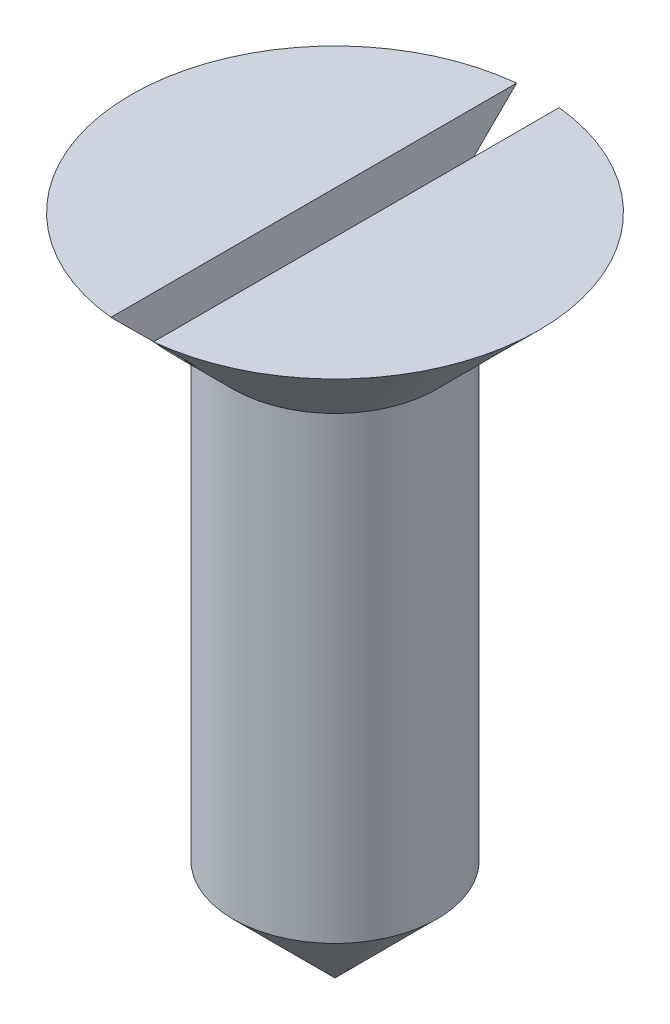
ISO-10303-21;
HEADER;
FILE_DESCRIPTION(('STEP AP214'),'2;1');
FILE_NAME('part.step','',(''),(''),'','','');
FILE_SCHEMA(('AUTOMOTIVE_DESIGN { 1 0 10303 214 1 1 1 1 }'));
ENDSEC;
DATA;
#1=APPLICATION_CONTEXT('core data for automotive mechanical design processes');
#2=APPLICATION_PROTOCOL_DEFINITION('international standard','automotive_design',2000,#1);
#3=PRODUCT_CONTEXT('',#1,'mechanical');
#4=PRODUCT('Part','Part','',(#3));
#5=PRODUCT_RELATED_PRODUCT_CATEGORY('part','',(#4));
#6=PRODUCT_DEFINITION_FORMATION('','',#4);
#7=PRODUCT_DEFINITION_CONTEXT('part definition',#1,'design');
#8=PRODUCT_DEFINITION('design','',#6,#7);
#9=PRODUCT_DEFINITION_SHAPE('','',#8);
#10=(LENGTH_UNIT() NAMED_UNIT(*) SI_UNIT(.MILLI.,.METRE.));
#11=(NAMED_UNIT(*) PLANE_ANGLE_UNIT() SI_UNIT($,.RADIAN.));
#12=(NAMED_UNIT(*) SI_UNIT($,.STERADIAN.) SOLID_ANGLE_UNIT());
#13=UNCERTAINTY_MEASURE_WITH_UNIT(LENGTH_MEASURE(1.E-05),#10,'distance_accuracy_value','');
#14=(GEOMETRIC_REPRESENTATION_CONTEXT(3) GLOBAL_UNCERTAINTY_ASSIGNED_CONTEXT((#13)) GLOBAL_UNIT_ASSIGNED_CONTEXT((#10,
#11,#12)) REPRESENTATION_CONTEXT('',''));
#15=CARTESIAN_POINT('',(0.,0.,0.));
#16=DIRECTION('',(0.,0.,1.));
#17=DIRECTION('',(1.,0.,0.));
#18=AXIS2_PLACEMENT_3D('',#15,#16,#17);
#19=CARTESIAN_POINT('',(0.,39.,-12.));
#20=DIRECTION('',(0.,-1.,0.));
#21=DIRECTION('',(0.,0.,-1.));
#22=AXIS2_PLACEMENT_3D('',#19,#20,#21);
#23=PLANE('',#22);
#24=CARTESIAN_POINT('',(0.,39.,0.));
#25=DIRECTION('',(0.,1.,0.));
#26=DIRECTION('',(0.,0.,1.));
#27=AXIS2_PLACEMENT_3D('',#24,#25,#26);
#28=CIRCLE('',#27,12.);
#29=CARTESIAN_POINT('',(-1.25,39.,-11.93471826228));
#30=VERTEX_POINT('',#29);
#31=CARTESIAN_POINT('',(-1.25,39.,11.93471826228));
#32=VERTEX_POINT('',#31);
#33=EDGE_CURVE('E127',#30,#32,#28,.T.);
#34=ORIENTED_EDGE('',*,*,#33,.T.);
#35=DIRECTION('',(0.,0.,1.));
#36=VECTOR('',#35,1.);
#37=CARTESIAN_POINT('',(-1.25,39.,-12.));
#38=LINE('',#37,#36);
#39=EDGE_CURVE('E140',#30,#32,#38,.T.);
#40=ORIENTED_EDGE('',*,*,#39,.F.);
#41=EDGE_LOOP('',(#34,#40));
#42=FACE_BOUND('',#41,.T.);
#43=ADVANCED_FACE('F46',(#42),#23,.F.);
#44=CARTESIAN_POINT('',(1.25,39.,11.93471826228));
#45=VERTEX_POINT('',#44);
#46=CARTESIAN_POINT('',(1.25,39.,-11.93471826228));
#47=VERTEX_POINT('',#46);
#48=EDGE_CURVE('E115',#45,#47,#28,.T.);
#49=ORIENTED_EDGE('',*,*,#48,.T.);
#50=DIRECTION('',(0.,0.,1.));
#51=VECTOR('',#50,1.);
#52=CARTESIAN_POINT('',(1.25,39.,-12.));
#53=LINE('',#52,#51);
#54=EDGE_CURVE('E109',#47,#45,#53,.T.);
#55=ORIENTED_EDGE('',*,*,#54,.T.);
#56=EDGE_LOOP('',(#49,#55));
#57=FACE_BOUND('',#56,.T.);
#58=ADVANCED_FACE('F48',(#57),#23,.F.);
#59=CARTESIAN_POINT('',(0.,33.,0.));
#60=DIRECTION('',(0.,1.,0.));
#61=DIRECTION('',(0.,0.,1.));
#62=AXIS2_PLACEMENT_3D('',#59,#60,#61);
#63=CONICAL_SURFACE('',#62,6.,0.785398163397449);
#64=CARTESIAN_POINT('',(0.,36.5,0.));
#65=DIRECTION('',(0.,-1.,0.));
#66=DIRECTION('',(0.,0.,-1.));
#67=AXIS2_PLACEMENT_3D('',#64,#65,#66);
#68=CIRCLE('',#67,9.49999999999999);
#69=CARTESIAN_POINT('',(1.25,36.5,9.41740410091868));
#70=VERTEX_POINT('',#69);
#71=CARTESIAN_POINT('',(-1.25,36.5,9.41740410091868));
#72=VERTEX_POINT('',#71);
#73=EDGE_CURVE('E93',#70,#72,#68,.T.);
#74=ORIENTED_EDGE('',*,*,#73,.T.);
#75=CARTESIAN_POINT('',(-1.25,39.0007,-11.9354220909861));
#76=CARTESIAN_POINT('',(-1.25,38.6525245051096,-11.5853335580358));
#77=CARTESIAN_POINT('',(-1.25,38.3044242351181,-11.2351701150766));
#78=CARTESIAN_POINT('',(-1.25,37.6083997013895,-10.5345761604297));
#79=CARTESIAN_POINT('',(-1.25,37.260475467087,-10.1841456195013));
#80=CARTESIAN_POINT('',(-1.25,36.5638094649016,-9.48187261037133));
#81=CARTESIAN_POINT('',(-1.25,36.2150686376639,-9.13002920888125));
#82=CARTESIAN_POINT('',(-1.25,35.5180469301886,-8.42597796118086));
#83=CARTESIAN_POINT('',(-1.25,35.1697659958149,-8.07377016858714));
#84=CARTESIAN_POINT('',(-1.25,34.5835484113192,-7.47991876315877));
#85=CARTESIAN_POINT('',(-1.25,34.3454501475208,-7.23843471058512));
#86=CARTESIAN_POINT('',(-1.25,33.8696338699101,-6.75508570505137));
#87=CARTESIAN_POINT('',(-1.25,33.6319158612806,-6.51322074698736));
#88=CARTESIAN_POINT('',(-1.25,33.1569017391557,-6.02886263739927));
#89=CARTESIAN_POINT('',(-1.25,32.9196058643398,-5.78636925172159));
#90=CARTESIAN_POINT('',(-1.25,32.4457841652544,-5.30065426789219));
#91=CARTESIAN_POINT('',(-1.25,32.2092583028591,-5.05743270697563));
#92=CARTESIAN_POINT('',(-1.25,31.7380212186018,-4.57056656101441));
#93=CARTESIAN_POINT('',(-1.25,31.5033067580083,-4.32692511205818));
#94=CARTESIAN_POINT('',(-1.25,31.0356433755412,-3.83785715356192));
#95=CARTESIAN_POINT('',(-1.25,30.802694798138,-3.5924303131586));
#96=CARTESIAN_POINT('',(-1.25,30.4558116431846,-3.2221040902199));
#97=CARTESIAN_POINT('',(-1.25,30.3406552607435,-3.09835036206003));
#98=CARTESIAN_POINT('',(-1.25,30.1114963369343,-2.84978045689656));
#99=CARTESIAN_POINT('',(-1.25,29.9974937738428,-2.72496429997744));
#100=CARTESIAN_POINT('',(-1.25,29.7711960829232,-2.4738608234374));
#101=CARTESIAN_POINT('',(-1.25,29.6589004417358,-2.34757396715293));
#102=CARTESIAN_POINT('',(-1.25,29.436859547192,-2.09278298539628));
#103=CARTESIAN_POINT('',(-1.25,29.3271139756621,-1.96427914006313));
#104=CARTESIAN_POINT('',(-1.25,29.1774082722368,-1.78309022945998));
#105=CARTESIAN_POINT('',(-1.25,29.1356513559321,-1.73189116307278));
#106=CARTESIAN_POINT('',(-1.25,29.0529570382234,-1.62882904129065));
#107=CARTESIAN_POINT('',(-1.25,29.0120196825618,-1.57696594909774));
#108=CARTESIAN_POINT('',(-1.25,28.9310932318212,-1.4723191243794));
#109=CARTESIAN_POINT('',(-1.25,28.8911064367148,-1.41953360786599));
#110=CARTESIAN_POINT('',(-1.25,28.8124816309744,-1.31296791579874));
#111=CARTESIAN_POINT('',(-1.25,28.7738435381623,-1.25918780115358));
#112=CARTESIAN_POINT('',(-1.25,28.6991593148868,-1.15156923623819));
#113=CARTESIAN_POINT('',(-1.25,28.6630751540591,-1.09775732173723));
#114=CARTESIAN_POINT('',(-1.25,28.5931825883663,-0.98867851148293));
#115=CARTESIAN_POINT('',(-1.25,28.5593736969807,-0.933411930319338));
#116=CARTESIAN_POINT('',(-1.25,28.4949486286121,-0.821263218535581));
#117=CARTESIAN_POINT('',(-1.25,28.4643227077729,-0.764386739962954));
#118=CARTESIAN_POINT('',(-1.25,28.4073327663661,-0.648555286148307));
#119=CARTESIAN_POINT('',(-1.25,28.3809646157921,-0.589602393471735));
#120=CARTESIAN_POINT('',(-1.25,28.3428892594081,-0.49197789625088));
#121=CARTESIAN_POINT('',(-1.25,28.3293952980765,-0.454005435763385));
#122=CARTESIAN_POINT('',(-1.25,28.3051566046379,-0.377176692319916));
#123=CARTESIAN_POINT('',(-1.25,28.2944121158857,-0.33832033146147));
#124=CARTESIAN_POINT('',(-1.25,28.2761990986869,-0.260045837222044));
#125=CARTESIAN_POINT('',(-1.25,28.2687141052042,-0.220631590767506));
#126=CARTESIAN_POINT('',(-1.25,28.2573473696156,-0.141289084674286));
#127=CARTESIAN_POINT('',(-1.25,28.2534646603366,-0.101360965925223));
#128=CARTESIAN_POINT('',(-1.25,28.2495275508759,-0.0209912945952001));
#129=CARTESIAN_POINT('',(-1.25,28.2495039629859,0.0194518120669204));
#130=CARTESIAN_POINT('',(-1.25,28.2533549428478,0.100142095433587));
#131=CARTESIAN_POINT('',(-1.25,28.2572295713321,0.140389269075773));
#132=CARTESIAN_POINT('',(-1.25,28.2744220170101,0.260627237955868));
#133=CARTESIAN_POINT('',(-1.25,28.2933192086121,0.339848721368009));
#134=CARTESIAN_POINT('',(-1.25,28.3369996632204,0.477952449732306));
#135=CARTESIAN_POINT('',(-1.25,28.3596588536414,0.53756019885441));
#136=CARTESIAN_POINT('',(-1.25,28.4100540592309,0.654626703701392));
#137=CARTESIAN_POINT('',(-1.25,28.4377942910572,0.712083626442973));
#138=CARTESIAN_POINT('',(-1.25,28.4970797779295,0.825279661233912));
#139=CARTESIAN_POINT('',(-1.25,28.5286409647805,0.881010272725492));
#140=CARTESIAN_POINT('',(-1.25,28.5944529567601,0.990811205534264));
#141=CARTESIAN_POINT('',(-1.25,28.6287025732185,1.04488224607261));
#142=CARTESIAN_POINT('',(-1.25,28.706111257564,1.16216243800432));
#143=CARTESIAN_POINT('',(-1.25,28.7497008806269,1.22508556204342));
#144=CARTESIAN_POINT('',(-1.25,28.8389347525384,1.34946405056997));
#145=CARTESIAN_POINT('',(-1.25,28.8845793989563,1.41091912749546));
#146=CARTESIAN_POINT('',(-1.25,28.9774126218919,1.53271508372005));
#147=CARTESIAN_POINT('',(-1.25,29.0246022557831,1.59305515378818));
#148=CARTESIAN_POINT('',(-1.25,29.1201309129274,1.71282037918469));
#149=CARTESIAN_POINT('',(-1.25,29.1684699978561,1.772245485136));
#150=CARTESIAN_POINT('',(-1.25,29.315032031704,1.94970889129089));
#151=CARTESIAN_POINT('',(-1.25,29.4145794737038,2.06665177320021));
#152=CARTESIAN_POINT('',(-1.25,29.6158372128505,2.29856208993548));
#153=CARTESIAN_POINT('',(-1.25,29.717546619238,2.41353030435738));
#154=CARTESIAN_POINT('',(-1.25,29.9228336203681,2.64254418741588));
#155=CARTESIAN_POINT('',(-1.25,30.0264166899379,2.75658493991201));
#156=CARTESIAN_POINT('',(-1.25,30.2346495690056,2.98370692535466));
#157=CARTESIAN_POINT('',(-1.25,30.3392994843653,3.09678806099869));
#158=CARTESIAN_POINT('',(-1.25,30.5492131099833,3.32205963713631));
#159=CARTESIAN_POINT('',(-1.25,30.6544756550516,3.43425116459413));
#160=CARTESIAN_POINT('',(-1.25,30.8655774781278,3.65808266330164));
#161=CARTESIAN_POINT('',(-1.25,30.9714167367748,3.76972265283019));
#162=CARTESIAN_POINT('',(-1.25,31.2416062861267,4.05358272236062));
#163=CARTESIAN_POINT('',(-1.25,31.4062669307094,4.2255072755563));
#164=CARTESIAN_POINT('',(-1.25,31.7363301244144,4.56864310479997));
#165=CARTESIAN_POINT('',(-1.25,31.9017326766139,4.73985437788389));
#166=CARTESIAN_POINT('',(-1.25,32.398742505554,5.25272566021114));
#167=CARTESIAN_POINT('',(-1.25,32.7311444241238,5.59361526468402));
#168=CARTESIAN_POINT('',(-1.25,33.3973800552396,6.27445559409243));
#169=CARTESIAN_POINT('',(-1.25,33.7312146047303,6.61440549833784));
#170=CARTESIAN_POINT('',(-1.25,34.3996449682564,7.29354878227994));
#171=CARTESIAN_POINT('',(-1.25,34.7342407741569,7.63274216998474));
#172=CARTESIAN_POINT('',(-1.25,35.3961878876222,8.30277573987706));
#173=CARTESIAN_POINT('',(-1.25,35.7235275230669,8.6336274596084));
#174=CARTESIAN_POINT('',(-1.25,36.378553192289,9.2949900616984));
#175=CARTESIAN_POINT('',(-1.25,36.7062392272741,9.6255009428607));
#176=CARTESIAN_POINT('',(-1.25,37.3616137769747,10.2860214547972));
#177=CARTESIAN_POINT('',(-1.25,37.6893021001907,10.6160312756177));
#178=CARTESIAN_POINT('',(-1.25,38.3448710011219,11.2758572737765));
#179=CARTESIAN_POINT('',(-1.25,38.6727515780574,11.6056734518895));
#180=CARTESIAN_POINT('',(-1.25,39.0007,11.9354220909861));
#181=B_SPLINE_CURVE_WITH_KNOTS('',3,(#75,#76,#77,#78,#79,#80,#81,#82,#83,#84,#85,#86,#87,#88,
#89,#90,#91,#92,#93,#94,#95,#96,#97,#98,#99,#100,#101,#102,#103,#104,#105,#106,#107,#108,#109,
#110,#111,#112,#113,#114,#115,#116,#117,#118,#119,#120,#121,#122,#123,#124,#125,#126,#127,#128,
#129,#130,#131,#132,#133,#134,#135,#136,#137,#138,#139,#140,#141,#142,#143,#144,#145,#146,#147,
#148,#149,#150,#151,#152,#153,#154,#155,#156,#157,#158,#159,#160,#161,#162,#163,#164,#165,#166,
#167,#168,#169,#170,#171,#172,#173,#174,#175,#176,#177,#178,#179,#180),.UNSPECIFIED.,.F.,.F.,(4,
2,2,2,2,2,2,2,2,2,2,2,2,2,2,2,2,2,2,2,2,2,2,2,2,2,2,2,2,2,2,2,2,2,2,2,2,2,2,2,2,2,2,2,2,2,2,2,2,
2,2,2,4),(0.,1.48124734020911,2.96269095913178,4.44886889217836,5.93485266870816,
6.95222545257565,7.96961198666254,8.98745744626457,10.0052517183322,11.020170729965,
12.0352828744004,12.5424112024878,13.0495299648661,13.5564930661247,14.0633925699557,
14.2615902679118,14.459798997241,14.6584465356212,14.8570819489484,15.0514115121183,
15.2456993889189,15.4393738063946,15.6328592176713,15.7536715461804,15.8744945640453,
15.9946999686907,16.114873090185,16.2360056606475,16.3571401183279,16.6001939998898,
16.791251093002,16.9824674650419,17.1745105248865,17.3664691474144,17.596050131405,
17.8256757231008,18.055461895759,18.2852604259298,18.7459340615126,19.2064214374358,
19.6685940809082,20.1308130404963,20.5923341749688,21.0538399098706,21.7680076235377,
22.4821783019973,23.9105523309204,25.339922627226,26.769277720437,28.165532010017,
29.5617911839766,30.9569882432444,32.3521796828529),.UNSPECIFIED.);
#182=EDGE_CURVE('E12',#72,#32,#181,.T.);
#183=ORIENTED_EDGE('',*,*,#182,.T.);
#184=ORIENTED_EDGE('',*,*,#33,.F.);
#185=CARTESIAN_POINT('',(-1.25,36.5,-9.41740410091868));
#186=VERTEX_POINT('',#185);
#187=EDGE_CURVE('E50',#30,#186,#181,.T.);
#188=ORIENTED_EDGE('',*,*,#187,.T.);
#189=CARTESIAN_POINT('',(1.25,36.5,-9.41740410091868));
#190=VERTEX_POINT('',#189);
#191=EDGE_CURVE('E101',#186,#190,#68,.T.);
#192=ORIENTED_EDGE('',*,*,#191,.T.);
#193=CARTESIAN_POINT('',(1.25,39.0007,11.9354220909861));
#194=CARTESIAN_POINT('',(1.25,38.6525245051096,11.5853335580358));
#195=CARTESIAN_POINT('',(1.25,38.3044242351181,11.2351701150766));
#196=CARTESIAN_POINT('',(1.25,37.6083997013895,10.5345761604297));
#197=CARTESIAN_POINT('',(1.25,37.260475467087,10.1841456195013));
#198=CARTESIAN_POINT('',(1.25,36.5638094649016,9.48187261037132));
#199=CARTESIAN_POINT('',(1.25,36.2150686376639,9.13002920888124));
#200=CARTESIAN_POINT('',(1.25,35.5180469301886,8.42597796118085));
#201=CARTESIAN_POINT('',(1.25,35.1697659958149,8.07377016858713));
#202=CARTESIAN_POINT('',(1.25,34.5835484113192,7.47991876315877));
#203=CARTESIAN_POINT('',(1.25,34.3454501475208,7.23843471058511));
#204=CARTESIAN_POINT('',(1.25,33.8696338699101,6.75508570505136));
#205=CARTESIAN_POINT('',(1.25,33.6319158612806,6.51322074698735));
#206=CARTESIAN_POINT('',(1.25,33.1569017391557,6.02886263739926));
#207=CARTESIAN_POINT('',(1.25,32.9196058643398,5.78636925172158));
#208=CARTESIAN_POINT('',(1.25,32.4457841652544,5.30065426789218));
#209=CARTESIAN_POINT('',(1.25,32.2092583028591,5.05743270697562));
#210=CARTESIAN_POINT('',(1.25,31.7380212186018,4.5705665610144));
#211=CARTESIAN_POINT('',(1.25,31.5033067580083,4.32692511205817));
#212=CARTESIAN_POINT('',(1.25,31.0356433755412,3.83785715356191));
#213=CARTESIAN_POINT('',(1.25,30.802694798138,3.59243031315859));
#214=CARTESIAN_POINT('',(1.25,30.4558116431846,3.2221040902199));
#215=CARTESIAN_POINT('',(1.25,30.3406552607435,3.09835036206002));
#216=CARTESIAN_POINT('',(1.25,30.1114963369343,2.84978045689655));
#217=CARTESIAN_POINT('',(1.25,29.9974937738428,2.72496429997744));
#218=CARTESIAN_POINT('',(1.25,29.7711960829232,2.47386082343739));
#219=CARTESIAN_POINT('',(1.25,29.6589004417358,2.34757396715292));
#220=CARTESIAN_POINT('',(1.25,29.436859547192,2.09278298539628));
#221=CARTESIAN_POINT('',(1.25,29.3271139756621,1.96427914006313));
#222=CARTESIAN_POINT('',(1.25,29.1774082722368,1.78309022945998));
#223=CARTESIAN_POINT('',(1.25,29.1356513559321,1.73189116307278));
#224=CARTESIAN_POINT('',(1.25,29.0529570382234,1.62882904129065));
#225=CARTESIAN_POINT('',(1.25,29.0120196825618,1.57696594909774));
#226=CARTESIAN_POINT('',(1.25,28.9310932318212,1.4723191243794));
#227=CARTESIAN_POINT('',(1.25,28.8911064367148,1.41953360786599));
#228=CARTESIAN_POINT('',(1.25,28.8124816309744,1.31296791579874));
#229=CARTESIAN_POINT('',(1.25,28.7738435381623,1.25918780115358));
#230=CARTESIAN_POINT('',(1.25,28.6991593148867,1.15156923623819));
#231=CARTESIAN_POINT('',(1.25,28.6630751540591,1.09775732173723));
#232=CARTESIAN_POINT('',(1.25,28.5931825883663,0.988678511482929));
#233=CARTESIAN_POINT('',(1.25,28.5593736969807,0.933411930319337));
#234=CARTESIAN_POINT('',(1.25,28.4949486286121,0.821263218535581));
#235=CARTESIAN_POINT('',(1.25,28.4643227077729,0.764386739962954));
#236=CARTESIAN_POINT('',(1.25,28.4073327663661,0.648555286148308));
#237=CARTESIAN_POINT('',(1.25,28.3809646157921,0.589602393471735));
#238=CARTESIAN_POINT('',(1.25,28.3428892594081,0.49197789625088));
#239=CARTESIAN_POINT('',(1.25,28.3293952980765,0.454005435763384));
#240=CARTESIAN_POINT('',(1.25,28.3051566046379,0.377176692319916));
#241=CARTESIAN_POINT('',(1.25,28.2944121158857,0.33832033146147));
#242=CARTESIAN_POINT('',(1.25,28.2761990986869,0.260045837222045));
#243=CARTESIAN_POINT('',(1.25,28.2687141052042,0.220631590767506));
#244=CARTESIAN_POINT('',(1.25,28.2573473696156,0.141289084674287));
#245=CARTESIAN_POINT('',(1.25,28.2534646603366,0.101360965925224));
#246=CARTESIAN_POINT('',(1.25,28.2495275508759,0.0209912945952015));
#247=CARTESIAN_POINT('',(1.25,28.2495039629859,-0.0194518120669193));
#248=CARTESIAN_POINT('',(1.25,28.2533549428478,-0.100142095433587));
#249=CARTESIAN_POINT('',(1.25,28.2572295713321,-0.140389269075773));
#250=CARTESIAN_POINT('',(1.25,28.2744220170101,-0.260627237955867));
#251=CARTESIAN_POINT('',(1.25,28.2933192086121,-0.339848721368008));
#252=CARTESIAN_POINT('',(1.25,28.3369996632204,-0.477952449732306));
#253=CARTESIAN_POINT('',(1.25,28.3596588536414,-0.537560198854412));
#254=CARTESIAN_POINT('',(1.25,28.4100540592309,-0.654626703701393));
#255=CARTESIAN_POINT('',(1.25,28.4377942910572,-0.712083626442973));
#256=CARTESIAN_POINT('',(1.25,28.4970797779295,-0.825279661233913));
#257=CARTESIAN_POINT('',(1.25,28.5286409647805,-0.881010272725494));
#258=CARTESIAN_POINT('',(1.25,28.5944529567601,-0.990811205534266));
#259=CARTESIAN_POINT('',(1.25,28.6287025732185,-1.04488224607261));
#260=CARTESIAN_POINT('',(1.25,28.706111257564,-1.16216243800432));
#261=CARTESIAN_POINT('',(1.25,28.7497008806269,-1.22508556204342));
#262=CARTESIAN_POINT('',(1.25,28.8389347525384,-1.34946405056997));
#263=CARTESIAN_POINT('',(1.25,28.8845793989563,-1.41091912749545));
#264=CARTESIAN_POINT('',(1.25,28.9774126218919,-1.53271508372004));
#265=CARTESIAN_POINT('',(1.25,29.0246022557831,-1.59305515378817));
#266=CARTESIAN_POINT('',(1.25,29.1201309129274,-1.71282037918469));
#267=CARTESIAN_POINT('',(1.25,29.1684699978561,-1.77224548513599));
#268=CARTESIAN_POINT('',(1.25,29.315032031704,-1.94970889129088));
#269=CARTESIAN_POINT('',(1.25,29.4145794737038,-2.0666517732002));
#270=CARTESIAN_POINT('',(1.25,29.6158372128505,-2.29856208993547));
#271=CARTESIAN_POINT('',(1.25,29.717546619238,-2.41353030435737));
#272=CARTESIAN_POINT('',(1.25,29.9228336203681,-2.64254418741587));
#273=CARTESIAN_POINT('',(1.25,30.0264166899379,-2.756584939912));
#274=CARTESIAN_POINT('',(1.25,30.2346495690056,-2.98370692535465));
#275=CARTESIAN_POINT('',(1.25,30.3392994843652,-3.09678806099868));
#276=CARTESIAN_POINT('',(1.25,30.5492131099833,-3.3220596371363));
#277=CARTESIAN_POINT('',(1.25,30.6544756550516,-3.43425116459412));
#278=CARTESIAN_POINT('',(1.25,30.8655774781278,-3.65808266330163));
#279=CARTESIAN_POINT('',(1.25,30.9714167367748,-3.76972265283018));
#280=CARTESIAN_POINT('',(1.25,31.2416062861267,-4.05358272236061));
#281=CARTESIAN_POINT('',(1.25,31.4062669307094,-4.2255072755563));
#282=CARTESIAN_POINT('',(1.25,31.7363301244144,-4.56864310479997));
#283=CARTESIAN_POINT('',(1.25,31.9017326766139,-4.73985437788388));
#284=CARTESIAN_POINT('',(1.25,32.398742505554,-5.25272566021113));
#285=CARTESIAN_POINT('',(1.25,32.7311444241238,-5.59361526468401));
#286=CARTESIAN_POINT('',(1.25,33.3973800552395,-6.27445559409242));
#287=CARTESIAN_POINT('',(1.25,33.7312146047303,-6.61440549833783));
#288=CARTESIAN_POINT('',(1.25,34.3996449682564,-7.29354878227994));
#289=CARTESIAN_POINT('',(1.25,34.7342407741569,-7.63274216998474));
#290=CARTESIAN_POINT('',(1.25,35.3961878876222,-8.30277573987706));
#291=CARTESIAN_POINT('',(1.25,35.7235275230669,-8.6336274596084));
#292=CARTESIAN_POINT('',(1.25,36.378553192289,-9.2949900616984));
#293=CARTESIAN_POINT('',(1.25,36.7062392272741,-9.6255009428607));
#294=CARTESIAN_POINT('',(1.25,37.3616137769747,-10.2860214547972));
#295=CARTESIAN_POINT('',(1.25,37.6893021001907,-10.6160312756177));
#296=CARTESIAN_POINT('',(1.25,38.3448710011219,-11.2758572737765));
#297=CARTESIAN_POINT('',(1.25,38.6727515780574,-11.6056734518895));
#298=CARTESIAN_POINT('',(1.25,39.0007,-11.9354220909861));
#299=B_SPLINE_CURVE_WITH_KNOTS('',3,(#193,#194,#195,#196,#197,#198,#199,#200,#201,#202,#203,
#204,#205,#206,#207,#208,#209,#210,#211,#212,#213,#214,#215,#216,#217,#218,#219,#220,#221,#222,
#223,#224,#225,#226,#227,#228,#229,#230,#231,#232,#233,#234,#235,#236,#237,#238,#239,#240,#241,
#242,#243,#244,#245,#246,#247,#248,#249,#250,#251,#252,#253,#254,#255,#256,#257,#258,#259,#260,
#261,#262,#263,#264,#265,#266,#267,#268,#269,#270,#271,#272,#273,#274,#275,#276,#277,#278,#279,
#280,#281,#282,#283,#284,#285,#286,#287,#288,#289,#290,#291,#292,#293,#294,#295,#296,#297,#298),
.UNSPECIFIED.,.F.,.F.,(4,2,2,2,2,2,2,2,2,2,2,2,2,2,2,2,2,2,2,2,2,2,2,2,2,2,2,2,2,2,2,2,2,2,2,2,
2,2,2,2,2,2,2,2,2,2,2,2,2,2,2,2,4),(0.,1.48124734020911,2.9626909591318,4.44886889217837,
5.93485266870818,6.95222545257567,7.96961198666255,8.98745744626458,10.0052517183322,
11.020170729965,12.0352828744004,12.5424112024878,13.0495299648662,13.5564930661247,
14.0633925699557,14.2615902679118,14.459798997241,14.6584465356212,14.8570819489484,
15.0514115121183,15.2456993889189,15.4393738063946,15.6328592176713,15.7536715461804,
15.8744945640453,15.9946999686907,16.114873090185,16.2360056606475,16.3571401183279,
16.6001939998898,16.791251093002,16.9824674650419,17.1745105248865,17.3664691474144,
17.596050131405,17.8256757231008,18.055461895759,18.2852604259298,18.7459340615126,
19.2064214374358,19.6685940809082,20.1308130404963,20.5923341749688,21.0538399098706,
21.7680076235377,22.4821783019973,23.9105523309204,25.339922627226,26.769277720437,
28.165532010017,29.5617911839766,30.9569882432444,32.3521796828529),.UNSPECIFIED.);
#300=EDGE_CURVE('E106',#190,#47,#299,.T.);
#301=ORIENTED_EDGE('',*,*,#300,.T.);
#302=ORIENTED_EDGE('',*,*,#48,.F.);
#303=EDGE_CURVE('E61',#45,#70,#299,.T.);
#304=ORIENTED_EDGE('',*,*,#303,.T.);
#305=EDGE_LOOP('',(#74,#183,#184,#188,#192,#301,#302,#304));
#306=FACE_BOUND('',#305,.T.);
#307=CARTESIAN_POINT('',(0.,33.,0.));
#308=DIRECTION('',(0.,1.,0.));
#309=DIRECTION('',(0.,0.,1.));
#310=AXIS2_PLACEMENT_3D('',#307,#308,#309);
#311=CIRCLE('',#310,6.);
#312=CARTESIAN_POINT('',(0.,33.,6.));
#313=VERTEX_POINT('',#312);
#314=EDGE_CURVE('E132',#313,#313,#311,.T.);
#315=ORIENTED_EDGE('',*,*,#314,.T.);
#316=EDGE_LOOP('',(#315));
#317=FACE_BOUND('',#316,.T.);
#318=ADVANCED_FACE('F112',(#306,#317),#63,.T.);
#319=CARTESIAN_POINT('',(0.,39.,0.));
#320=DIRECTION('',(0.,1.,0.));
#321=DIRECTION('',(0.,0.,1.));
#322=AXIS2_PLACEMENT_3D('',#319,#320,#321);
#323=CYLINDRICAL_SURFACE('',#322,6.);
#324=ORIENTED_EDGE('',*,*,#314,.F.);
#325=EDGE_LOOP('',(#324));
#326=FACE_BOUND('',#325,.T.);
#327=CARTESIAN_POINT('',(0.,5.99999999999999,0.));
#328=DIRECTION('',(0.,1.,0.));
#329=DIRECTION('',(0.,0.,1.));
#330=AXIS2_PLACEMENT_3D('',#327,#328,#329);
#331=CIRCLE('',#330,6.);
#332=CARTESIAN_POINT('',(0.,5.99999999999999,6.));
#333=VERTEX_POINT('',#332);
#334=EDGE_CURVE('E136',#333,#333,#331,.T.);
#335=ORIENTED_EDGE('',*,*,#334,.T.);
#336=EDGE_LOOP('',(#335));
#337=FACE_BOUND('',#336,.T.);
#338=ADVANCED_FACE('F160',(#326,#337),#323,.T.);
#339=CARTESIAN_POINT('',(0.,0.,0.));
#340=DIRECTION('',(0.,1.,0.));
#341=DIRECTION('',(0.,0.,1.));
#342=AXIS2_PLACEMENT_3D('',#339,#340,#341);
#343=CONICAL_SURFACE('',#342,0.,0.785398163397449);
#344=ORIENTED_EDGE('',*,*,#334,.F.);
#345=EDGE_LOOP('',(#344));
#346=FACE_BOUND('',#345,.T.);
#347=CARTESIAN_POINT('',(0.,0.,0.));
#348=VERTEX_POINT('',#347);
#349=VERTEX_LOOP('',#348);
#350=FACE_BOUND('',#349,.T.);
#351=ADVANCED_FACE('F165',(#346,#350),#343,.T.);
#352=CARTESIAN_POINT('',(-1.25,39.,-12.));
#353=DIRECTION('',(-1.,0.,0.));
#354=DIRECTION('',(0.,-1.,0.));
#355=AXIS2_PLACEMENT_3D('',#352,#353,#354);
#356=PLANE('',#355);
#357=ORIENTED_EDGE('',*,*,#39,.T.);
#358=ORIENTED_EDGE('',*,*,#182,.F.);
#359=DIRECTION('',(0.,0.,1.));
#360=VECTOR('',#359,1.);
#361=CARTESIAN_POINT('',(-1.25,36.5,-12.));
#362=LINE('',#361,#360);
#363=EDGE_CURVE('E96',#186,#72,#362,.T.);
#364=ORIENTED_EDGE('',*,*,#363,.F.);
#365=ORIENTED_EDGE('',*,*,#187,.F.);
#366=EDGE_LOOP('',(#357,#358,#364,#365));
#367=FACE_BOUND('',#366,.T.);
#368=ADVANCED_FACE('F148',(#367),#356,.F.);
#369=CARTESIAN_POINT('',(1.25,39.,-12.));
#370=DIRECTION('',(1.,0.,0.));
#371=DIRECTION('',(0.,1.,0.));
#372=AXIS2_PLACEMENT_3D('',#369,#370,#371);
#373=PLANE('',#372);
#374=ORIENTED_EDGE('',*,*,#54,.F.);
#375=ORIENTED_EDGE('',*,*,#300,.F.);
#376=DIRECTION('',(0.,0.,1.));
#377=VECTOR('',#376,1.);
#378=CARTESIAN_POINT('',(1.25,36.5,-12.));
#379=LINE('',#378,#377);
#380=EDGE_CURVE('E68',#190,#70,#379,.T.);
#381=ORIENTED_EDGE('',*,*,#380,.T.);
#382=ORIENTED_EDGE('',*,*,#303,.F.);
#383=EDGE_LOOP('',(#374,#375,#381,#382));
#384=FACE_BOUND('',#383,.T.);
#385=ADVANCED_FACE('F103',(#384),#373,.F.);
#386=CARTESIAN_POINT('',(-1.25,36.5,-12.));
#387=DIRECTION('',(0.,-1.,0.));
#388=DIRECTION('',(0.,0.,-1.));
#389=AXIS2_PLACEMENT_3D('',#386,#387,#388);
#390=PLANE('',#389);
#391=ORIENTED_EDGE('',*,*,#380,.F.);
#392=ORIENTED_EDGE('',*,*,#191,.F.);
#393=ORIENTED_EDGE('',*,*,#363,.T.);
#394=ORIENTED_EDGE('',*,*,#73,.F.);
#395=EDGE_LOOP('',(#391,#392,#393,#394));
#396=FACE_BOUND('',#395,.T.);
#397=ADVANCED_FACE('F94',(#396),#390,.F.);
#398=CLOSED_SHELL('',(#43,#58,#318,#338,#351,#368,#385,#397));
#399=MANIFOLD_SOLID_BREP('B2',#398);
#400=ADVANCED_BREP_SHAPE_REPRESENTATION('',(#18,#399),#14);
#401=SHAPE_DEFINITION_REPRESENTATION(#9,#400);
ENDSEC;
END-ISO-10303-21;
